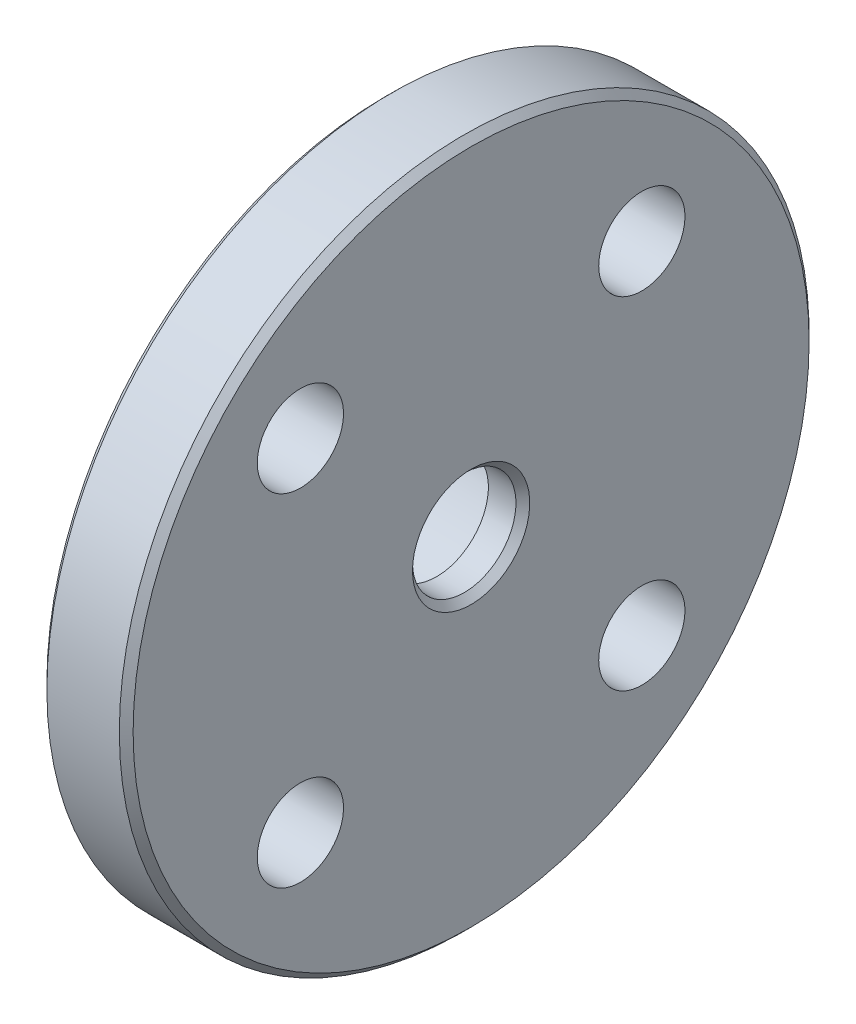
ISO-10303-21;
HEADER;
FILE_DESCRIPTION(('STEP AP214'),'2;1');
FILE_NAME('part.step','',(''),(''),'','','');
FILE_SCHEMA(('AUTOMOTIVE_DESIGN { 1 0 10303 214 1 1 1 1 }'));
ENDSEC;
DATA;
#1=APPLICATION_CONTEXT('core data for automotive mechanical design processes');
#2=APPLICATION_PROTOCOL_DEFINITION('international standard','automotive_design',2000,#1);
#3=PRODUCT_CONTEXT('',#1,'mechanical');
#4=PRODUCT('Part','Part','',(#3));
#5=PRODUCT_RELATED_PRODUCT_CATEGORY('part','',(#4));
#6=PRODUCT_DEFINITION_FORMATION('','',#4);
#7=PRODUCT_DEFINITION_CONTEXT('part definition',#1,'design');
#8=PRODUCT_DEFINITION('design','',#6,#7);
#9=PRODUCT_DEFINITION_SHAPE('','',#8);
#10=(LENGTH_UNIT() NAMED_UNIT(*) SI_UNIT(.MILLI.,.METRE.));
#11=(NAMED_UNIT(*) PLANE_ANGLE_UNIT() SI_UNIT($,.RADIAN.));
#12=(NAMED_UNIT(*) SI_UNIT($,.STERADIAN.) SOLID_ANGLE_UNIT());
#13=UNCERTAINTY_MEASURE_WITH_UNIT(LENGTH_MEASURE(1.E-05),#10,'distance_accuracy_value','');
#14=(GEOMETRIC_REPRESENTATION_CONTEXT(3) GLOBAL_UNCERTAINTY_ASSIGNED_CONTEXT((#13)) GLOBAL_UNIT_ASSIGNED_CONTEXT((#10,
#11,#12)) REPRESENTATION_CONTEXT('',''));
#15=CARTESIAN_POINT('',(0.,0.,0.));
#16=DIRECTION('',(0.,0.,1.));
#17=DIRECTION('',(1.,0.,0.));
#18=AXIS2_PLACEMENT_3D('',#15,#16,#17);
#19=CARTESIAN_POINT('',(0.,0.,0.));
#20=DIRECTION('',(-1.,0.,0.));
#21=DIRECTION('',(0.,0.,1.));
#22=AXIS2_PLACEMENT_3D('',#19,#20,#21);
#23=CYLINDRICAL_SURFACE('',#22,3.);
#24=CARTESIAN_POINT('',(3.5,0.,0.));
#25=DIRECTION('',(-1.,0.,0.));
#26=DIRECTION('',(0.,0.,1.));
#27=AXIS2_PLACEMENT_3D('',#24,#25,#26);
#28=CIRCLE('',#27,3.);
#29=CARTESIAN_POINT('',(3.5,0.,3.));
#30=VERTEX_POINT('',#29);
#31=EDGE_CURVE('E73',#30,#30,#28,.T.);
#32=ORIENTED_EDGE('',*,*,#31,.F.);
#33=EDGE_LOOP('',(#32));
#34=FACE_BOUND('',#33,.T.);
#35=CARTESIAN_POINT('',(0.,0.,0.));
#36=DIRECTION('',(-1.,0.,0.));
#37=DIRECTION('',(0.,0.,1.));
#38=AXIS2_PLACEMENT_3D('',#35,#36,#37);
#39=CIRCLE('',#38,3.);
#40=CARTESIAN_POINT('',(0.,0.,3.));
#41=VERTEX_POINT('',#40);
#42=EDGE_CURVE('E64',#41,#41,#39,.T.);
#43=ORIENTED_EDGE('',*,*,#42,.T.);
#44=EDGE_LOOP('',(#43));
#45=FACE_BOUND('',#44,.T.);
#46=ADVANCED_FACE('F32',(#34,#45),#23,.F.);
#47=CARTESIAN_POINT('',(0.,3.,0.));
#48=DIRECTION('',(1.,0.,0.));
#49=DIRECTION('',(0.,0.,-1.));
#50=AXIS2_PLACEMENT_3D('',#47,#48,#49);
#51=PLANE('',#50);
#52=CARTESIAN_POINT('',(0.,0.,0.));
#53=DIRECTION('',(1.,0.,0.));
#54=DIRECTION('',(0.,0.,-1.));
#55=AXIS2_PLACEMENT_3D('',#52,#53,#54);
#56=CIRCLE('',#55,4.3);
#57=CARTESIAN_POINT('',(0.,0.,-4.3));
#58=VERTEX_POINT('',#57);
#59=EDGE_CURVE('E39',#58,#58,#56,.F.);
#60=ORIENTED_EDGE('',*,*,#59,.T.);
#61=EDGE_LOOP('',(#60));
#62=FACE_BOUND('',#61,.T.);
#63=ORIENTED_EDGE('',*,*,#42,.F.);
#64=EDGE_LOOP('',(#63));
#65=FACE_BOUND('',#64,.T.);
#66=ADVANCED_FACE('F124',(#62,#65),#51,.F.);
#67=CARTESIAN_POINT('',(0.,0.,0.));
#68=DIRECTION('',(-1.,0.,0.));
#69=DIRECTION('',(0.,0.,1.));
#70=AXIS2_PLACEMENT_3D('',#67,#68,#69);
#71=CYLINDRICAL_SURFACE('',#70,4.5);
#72=CARTESIAN_POINT('',(0.200000000000001,0.,0.));
#73=DIRECTION('',(1.,0.,0.));
#74=DIRECTION('',(0.,0.,-1.));
#75=AXIS2_PLACEMENT_3D('',#72,#73,#74);
#76=CIRCLE('',#75,4.5);
#77=CARTESIAN_POINT('',(0.200000000000001,0.,-4.5));
#78=VERTEX_POINT('',#77);
#79=EDGE_CURVE('E10',#78,#78,#76,.T.);
#80=ORIENTED_EDGE('',*,*,#79,.T.);
#81=EDGE_LOOP('',(#80));
#82=FACE_BOUND('',#81,.T.);
#83=CARTESIAN_POINT('',(2.,0.,0.));
#84=DIRECTION('',(-1.,0.,0.));
#85=DIRECTION('',(0.,0.,1.));
#86=AXIS2_PLACEMENT_3D('',#83,#84,#85);
#87=CIRCLE('',#86,4.5);
#88=CARTESIAN_POINT('',(2.,0.,4.5));
#89=VERTEX_POINT('',#88);
#90=EDGE_CURVE('E67',#89,#89,#87,.T.);
#91=ORIENTED_EDGE('',*,*,#90,.T.);
#92=EDGE_LOOP('',(#91));
#93=FACE_BOUND('',#92,.T.);
#94=ADVANCED_FACE('F116',(#82,#93),#71,.T.);
#95=CARTESIAN_POINT('',(2.,4.5,0.));
#96=DIRECTION('',(1.,0.,0.));
#97=DIRECTION('',(0.,0.,-1.));
#98=AXIS2_PLACEMENT_3D('',#95,#96,#97);
#99=PLANE('',#98);
#100=CARTESIAN_POINT('',(2.,0.,0.));
#101=DIRECTION('',(1.,0.,0.));
#102=DIRECTION('',(0.,0.,-1.));
#103=AXIS2_PLACEMENT_3D('',#100,#101,#102);
#104=CIRCLE('',#103,9.79999999999999);
#105=CARTESIAN_POINT('',(2.,0.,-9.79999999999999));
#106=VERTEX_POINT('',#105);
#107=EDGE_CURVE('E43',#106,#106,#104,.F.);
#108=ORIENTED_EDGE('',*,*,#107,.T.);
#109=EDGE_LOOP('',(#108));
#110=FACE_BOUND('',#109,.T.);
#111=CARTESIAN_POINT('',(2.,4.94974746830582,-4.94974746830584));
#112=DIRECTION('',(-1.,0.,0.));
#113=DIRECTION('',(0.,0.,1.));
#114=AXIS2_PLACEMENT_3D('',#111,#112,#113);
#115=CIRCLE('',#114,1.25);
#116=CARTESIAN_POINT('',(2.,4.94974746830582,-3.69974746830584));
#117=VERTEX_POINT('',#116);
#118=EDGE_CURVE('E83',#117,#117,#115,.T.);
#119=ORIENTED_EDGE('',*,*,#118,.F.);
#120=EDGE_LOOP('',(#119));
#121=FACE_BOUND('',#120,.T.);
#122=CARTESIAN_POINT('',(2.,-4.94974746830584,-4.94974746830582));
#123=DIRECTION('',(-1.,0.,0.));
#124=DIRECTION('',(0.,0.,1.));
#125=AXIS2_PLACEMENT_3D('',#122,#123,#124);
#126=CIRCLE('',#125,1.25);
#127=CARTESIAN_POINT('',(2.,-4.94974746830584,-3.69974746830582));
#128=VERTEX_POINT('',#127);
#129=EDGE_CURVE('E89',#128,#128,#126,.T.);
#130=ORIENTED_EDGE('',*,*,#129,.F.);
#131=EDGE_LOOP('',(#130));
#132=FACE_BOUND('',#131,.T.);
#133=CARTESIAN_POINT('',(2.,-4.94974746830582,4.94974746830584));
#134=DIRECTION('',(-1.,0.,0.));
#135=DIRECTION('',(0.,0.,1.));
#136=AXIS2_PLACEMENT_3D('',#133,#134,#135);
#137=CIRCLE('',#136,1.25);
#138=CARTESIAN_POINT('',(2.,-4.94974746830582,6.19974746830584));
#139=VERTEX_POINT('',#138);
#140=EDGE_CURVE('E95',#139,#139,#137,.T.);
#141=ORIENTED_EDGE('',*,*,#140,.F.);
#142=EDGE_LOOP('',(#141));
#143=FACE_BOUND('',#142,.T.);
#144=CARTESIAN_POINT('',(2.,4.94974746830584,4.94974746830582));
#145=DIRECTION('',(-1.,0.,0.));
#146=DIRECTION('',(0.,0.,1.));
#147=AXIS2_PLACEMENT_3D('',#144,#145,#146);
#148=CIRCLE('',#147,1.25);
#149=CARTESIAN_POINT('',(2.,4.94974746830584,6.19974746830582));
#150=VERTEX_POINT('',#149);
#151=EDGE_CURVE('E77',#150,#150,#148,.T.);
#152=ORIENTED_EDGE('',*,*,#151,.F.);
#153=EDGE_LOOP('',(#152));
#154=FACE_BOUND('',#153,.T.);
#155=ORIENTED_EDGE('',*,*,#90,.F.);
#156=EDGE_LOOP('',(#155));
#157=FACE_BOUND('',#156,.T.);
#158=ADVANCED_FACE('F112',(#110,#121,#132,#143,#154,#157),#99,.F.);
#159=CARTESIAN_POINT('',(0.,0.,0.));
#160=DIRECTION('',(-1.,0.,0.));
#161=DIRECTION('',(0.,0.,1.));
#162=AXIS2_PLACEMENT_3D('',#159,#160,#161);
#163=CYLINDRICAL_SURFACE('',#162,10.);
#164=CARTESIAN_POINT('',(4.3,0.,0.));
#165=DIRECTION('',(-1.,0.,0.));
#166=DIRECTION('',(0.,0.,1.));
#167=AXIS2_PLACEMENT_3D('',#164,#165,#166);
#168=CIRCLE('',#167,10.);
#169=CARTESIAN_POINT('',(4.3,0.,10.));
#170=VERTEX_POINT('',#169);
#171=EDGE_CURVE('E47',#170,#170,#168,.T.);
#172=ORIENTED_EDGE('',*,*,#171,.T.);
#173=EDGE_LOOP('',(#172));
#174=FACE_BOUND('',#173,.T.);
#175=CARTESIAN_POINT('',(2.20000000000001,0.,0.));
#176=DIRECTION('',(1.,0.,0.));
#177=DIRECTION('',(0.,0.,-1.));
#178=AXIS2_PLACEMENT_3D('',#175,#176,#177);
#179=CIRCLE('',#178,10.);
#180=CARTESIAN_POINT('',(2.20000000000001,0.,-10.));
#181=VERTEX_POINT('',#180);
#182=EDGE_CURVE('E52',#181,#181,#179,.T.);
#183=ORIENTED_EDGE('',*,*,#182,.T.);
#184=EDGE_LOOP('',(#183));
#185=FACE_BOUND('',#184,.T.);
#186=ADVANCED_FACE('F115',(#174,#185),#163,.T.);
#187=CARTESIAN_POINT('',(4.5,10.,0.));
#188=DIRECTION('',(-1.,0.,0.));
#189=DIRECTION('',(0.,0.,1.));
#190=AXIS2_PLACEMENT_3D('',#187,#188,#189);
#191=PLANE('',#190);
#192=CARTESIAN_POINT('',(4.5,0.,0.));
#193=DIRECTION('',(-1.,0.,0.));
#194=DIRECTION('',(0.,0.,1.));
#195=AXIS2_PLACEMENT_3D('',#192,#193,#194);
#196=CIRCLE('',#195,1.7);
#197=CARTESIAN_POINT('',(4.5,0.,1.7));
#198=VERTEX_POINT('',#197);
#199=EDGE_CURVE('E58',#198,#198,#196,.T.);
#200=ORIENTED_EDGE('',*,*,#199,.T.);
#201=EDGE_LOOP('',(#200));
#202=FACE_BOUND('',#201,.T.);
#203=CARTESIAN_POINT('',(4.5,0.,0.));
#204=DIRECTION('',(-1.,0.,0.));
#205=DIRECTION('',(0.,0.,1.));
#206=AXIS2_PLACEMENT_3D('',#203,#204,#205);
#207=CIRCLE('',#206,9.79999999999999);
#208=CARTESIAN_POINT('',(4.5,0.,9.79999999999999));
#209=VERTEX_POINT('',#208);
#210=EDGE_CURVE('E61',#209,#209,#207,.F.);
#211=ORIENTED_EDGE('',*,*,#210,.T.);
#212=EDGE_LOOP('',(#211));
#213=FACE_BOUND('',#212,.T.);
#214=CARTESIAN_POINT('',(4.5,4.94974746830582,-4.94974746830584));
#215=DIRECTION('',(-1.,0.,0.));
#216=DIRECTION('',(0.,0.,1.));
#217=AXIS2_PLACEMENT_3D('',#214,#215,#216);
#218=CIRCLE('',#217,1.25);
#219=CARTESIAN_POINT('',(4.5,4.94974746830582,-3.69974746830584));
#220=VERTEX_POINT('',#219);
#221=EDGE_CURVE('E86',#220,#220,#218,.T.);
#222=ORIENTED_EDGE('',*,*,#221,.T.);
#223=EDGE_LOOP('',(#222));
#224=FACE_BOUND('',#223,.T.);
#225=CARTESIAN_POINT('',(4.5,-4.94974746830584,-4.94974746830582));
#226=DIRECTION('',(-1.,0.,0.));
#227=DIRECTION('',(0.,0.,1.));
#228=AXIS2_PLACEMENT_3D('',#225,#226,#227);
#229=CIRCLE('',#228,1.25);
#230=CARTESIAN_POINT('',(4.5,-4.94974746830584,-3.69974746830582));
#231=VERTEX_POINT('',#230);
#232=EDGE_CURVE('E92',#231,#231,#229,.T.);
#233=ORIENTED_EDGE('',*,*,#232,.T.);
#234=EDGE_LOOP('',(#233));
#235=FACE_BOUND('',#234,.T.);
#236=CARTESIAN_POINT('',(4.5,-4.94974746830582,4.94974746830584));
#237=DIRECTION('',(-1.,0.,0.));
#238=DIRECTION('',(0.,0.,1.));
#239=AXIS2_PLACEMENT_3D('',#236,#237,#238);
#240=CIRCLE('',#239,1.25);
#241=CARTESIAN_POINT('',(4.5,-4.94974746830582,6.19974746830584));
#242=VERTEX_POINT('',#241);
#243=EDGE_CURVE('E80',#242,#242,#240,.T.);
#244=ORIENTED_EDGE('',*,*,#243,.T.);
#245=EDGE_LOOP('',(#244));
#246=FACE_BOUND('',#245,.T.);
#247=CARTESIAN_POINT('',(4.5,4.94974746830584,4.94974746830582));
#248=DIRECTION('',(-1.,0.,0.));
#249=DIRECTION('',(0.,0.,1.));
#250=AXIS2_PLACEMENT_3D('',#247,#248,#249);
#251=CIRCLE('',#250,1.25);
#252=CARTESIAN_POINT('',(4.5,4.94974746830584,6.19974746830582));
#253=VERTEX_POINT('',#252);
#254=EDGE_CURVE('E76',#253,#253,#251,.T.);
#255=ORIENTED_EDGE('',*,*,#254,.T.);
#256=EDGE_LOOP('',(#255));
#257=FACE_BOUND('',#256,.T.);
#258=ADVANCED_FACE('F101',(#202,#213,#224,#235,#246,#257),#191,.F.);
#259=CARTESIAN_POINT('',(0.,0.,0.));
#260=DIRECTION('',(-1.,0.,0.));
#261=DIRECTION('',(0.,0.,1.));
#262=AXIS2_PLACEMENT_3D('',#259,#260,#261);
#263=CYLINDRICAL_SURFACE('',#262,1.5);
#264=CARTESIAN_POINT('',(4.30000000000001,0.,0.));
#265=DIRECTION('',(-1.,0.,0.));
#266=DIRECTION('',(0.,0.,1.));
#267=AXIS2_PLACEMENT_3D('',#264,#265,#266);
#268=CIRCLE('',#267,1.5);
#269=CARTESIAN_POINT('',(4.30000000000001,0.,1.5));
#270=VERTEX_POINT('',#269);
#271=EDGE_CURVE('E55',#270,#270,#268,.F.);
#272=ORIENTED_EDGE('',*,*,#271,.T.);
#273=EDGE_LOOP('',(#272));
#274=FACE_BOUND('',#273,.T.);
#275=CARTESIAN_POINT('',(3.5,0.,0.));
#276=DIRECTION('',(-1.,0.,0.));
#277=DIRECTION('',(0.,0.,1.));
#278=AXIS2_PLACEMENT_3D('',#275,#276,#277);
#279=CIRCLE('',#278,1.5);
#280=CARTESIAN_POINT('',(3.5,0.,1.5));
#281=VERTEX_POINT('',#280);
#282=EDGE_CURVE('E70',#281,#281,#279,.T.);
#283=ORIENTED_EDGE('',*,*,#282,.T.);
#284=EDGE_LOOP('',(#283));
#285=FACE_BOUND('',#284,.T.);
#286=ADVANCED_FACE('F177',(#274,#285),#263,.F.);
#287=CARTESIAN_POINT('',(3.5,1.5,0.));
#288=DIRECTION('',(1.,0.,0.));
#289=DIRECTION('',(0.,0.,-1.));
#290=AXIS2_PLACEMENT_3D('',#287,#288,#289);
#291=PLANE('',#290);
#292=ORIENTED_EDGE('',*,*,#282,.F.);
#293=EDGE_LOOP('',(#292));
#294=FACE_BOUND('',#293,.T.);
#295=ORIENTED_EDGE('',*,*,#31,.T.);
#296=EDGE_LOOP('',(#295));
#297=FACE_BOUND('',#296,.T.);
#298=ADVANCED_FACE('F173',(#294,#297),#291,.F.);
#299=CARTESIAN_POINT('',(4.5,4.94974746830584,4.94974746830582));
#300=DIRECTION('',(-1.,0.,0.));
#301=DIRECTION('',(0.,0.,1.));
#302=AXIS2_PLACEMENT_3D('',#299,#300,#301);
#303=CYLINDRICAL_SURFACE('',#302,1.25);
#304=CARTESIAN_POINT('',(4.5,4.94974746830584,6.19974746830582));
#305=CARTESIAN_POINT('',(4.47395833333333,4.94974746830584,6.19974746830582));
#306=CARTESIAN_POINT('',(4.44791666666667,4.94974746830584,6.19974746830582));
#307=CARTESIAN_POINT('',(4.39583333333333,4.94974746830584,6.19974746830582));
#308=CARTESIAN_POINT('',(4.36979166666667,4.94974746830584,6.19974746830582));
#309=CARTESIAN_POINT('',(4.31770833333333,4.94974746830584,6.19974746830582));
#310=CARTESIAN_POINT('',(4.29166666666667,4.94974746830584,6.19974746830582));
#311=CARTESIAN_POINT('',(4.23958333333333,4.94974746830584,6.19974746830582));
#312=CARTESIAN_POINT('',(4.21354166666667,4.94974746830584,6.19974746830582));
#313=CARTESIAN_POINT('',(4.16145833333333,4.94974746830584,6.19974746830582));
#314=CARTESIAN_POINT('',(4.13541666666667,4.94974746830584,6.19974746830582));
#315=CARTESIAN_POINT('',(4.08333333333333,4.94974746830584,6.19974746830582));
#316=CARTESIAN_POINT('',(4.05729166666667,4.94974746830584,6.19974746830582));
#317=CARTESIAN_POINT('',(4.00520833333333,4.94974746830584,6.19974746830582));
#318=CARTESIAN_POINT('',(3.97916666666667,4.94974746830584,6.19974746830582));
#319=CARTESIAN_POINT('',(3.92708333333333,4.94974746830584,6.19974746830582));
#320=CARTESIAN_POINT('',(3.90104166666667,4.94974746830584,6.19974746830582));
#321=CARTESIAN_POINT('',(3.84895833333333,4.94974746830584,6.19974746830582));
#322=CARTESIAN_POINT('',(3.82291666666667,4.94974746830584,6.19974746830582));
#323=CARTESIAN_POINT('',(3.77083333333333,4.94974746830584,6.19974746830582));
#324=CARTESIAN_POINT('',(3.74479166666667,4.94974746830584,6.19974746830582));
#325=CARTESIAN_POINT('',(3.69270833333333,4.94974746830584,6.19974746830582));
#326=CARTESIAN_POINT('',(3.66666666666667,4.94974746830584,6.19974746830582));
#327=CARTESIAN_POINT('',(3.61458333333333,4.94974746830584,6.19974746830582));
#328=CARTESIAN_POINT('',(3.58854166666667,4.94974746830584,6.19974746830582));
#329=CARTESIAN_POINT('',(3.53645833333333,4.94974746830584,6.19974746830582));
#330=CARTESIAN_POINT('',(3.51041666666667,4.94974746830584,6.19974746830582));
#331=CARTESIAN_POINT('',(3.45833333333333,4.94974746830584,6.19974746830582));
#332=CARTESIAN_POINT('',(3.43229166666667,4.94974746830584,6.19974746830582));
#333=CARTESIAN_POINT('',(3.38020833333333,4.94974746830584,6.19974746830582));
#334=CARTESIAN_POINT('',(3.35416666666667,4.94974746830584,6.19974746830582));
#335=CARTESIAN_POINT('',(3.30208333333333,4.94974746830584,6.19974746830582));
#336=CARTESIAN_POINT('',(3.27604166666667,4.94974746830584,6.19974746830582));
#337=CARTESIAN_POINT('',(3.22395833333333,4.94974746830584,6.19974746830582));
#338=CARTESIAN_POINT('',(3.19791666666667,4.94974746830584,6.19974746830582));
#339=CARTESIAN_POINT('',(3.14583333333333,4.94974746830584,6.19974746830582));
#340=CARTESIAN_POINT('',(3.11979166666667,4.94974746830584,6.19974746830582));
#341=CARTESIAN_POINT('',(3.06770833333333,4.94974746830584,6.19974746830582));
#342=CARTESIAN_POINT('',(3.04166666666667,4.94974746830584,6.19974746830582));
#343=CARTESIAN_POINT('',(2.98958333333333,4.94974746830584,6.19974746830582));
#344=CARTESIAN_POINT('',(2.96354166666667,4.94974746830584,6.19974746830582));
#345=CARTESIAN_POINT('',(2.91145833333333,4.94974746830584,6.19974746830582));
#346=CARTESIAN_POINT('',(2.88541666666667,4.94974746830584,6.19974746830582));
#347=CARTESIAN_POINT('',(2.83333333333333,4.94974746830584,6.19974746830582));
#348=CARTESIAN_POINT('',(2.80729166666667,4.94974746830584,6.19974746830582));
#349=CARTESIAN_POINT('',(2.75520833333333,4.94974746830584,6.19974746830582));
#350=CARTESIAN_POINT('',(2.72916666666667,4.94974746830584,6.19974746830582));
#351=CARTESIAN_POINT('',(2.67708333333333,4.94974746830584,6.19974746830582));
#352=CARTESIAN_POINT('',(2.65104166666667,4.94974746830584,6.19974746830582));
#353=CARTESIAN_POINT('',(2.59895833333333,4.94974746830584,6.19974746830582));
#354=CARTESIAN_POINT('',(2.57291666666667,4.94974746830584,6.19974746830582));
#355=CARTESIAN_POINT('',(2.52083333333333,4.94974746830584,6.19974746830582));
#356=CARTESIAN_POINT('',(2.49479166666667,4.94974746830584,6.19974746830582));
#357=CARTESIAN_POINT('',(2.44270833333333,4.94974746830584,6.19974746830582));
#358=CARTESIAN_POINT('',(2.41666666666667,4.94974746830584,6.19974746830582));
#359=CARTESIAN_POINT('',(2.36458333333333,4.94974746830584,6.19974746830582));
#360=CARTESIAN_POINT('',(2.33854166666667,4.94974746830584,6.19974746830582));
#361=CARTESIAN_POINT('',(2.28645833333333,4.94974746830584,6.19974746830582));
#362=CARTESIAN_POINT('',(2.26041666666667,4.94974746830584,6.19974746830582));
#363=CARTESIAN_POINT('',(2.20833333333333,4.94974746830584,6.19974746830582));
#364=CARTESIAN_POINT('',(2.18229166666667,4.94974746830584,6.19974746830582));
#365=CARTESIAN_POINT('',(2.13020833333333,4.94974746830584,6.19974746830582));
#366=CARTESIAN_POINT('',(2.10416666666667,4.94974746830584,6.19974746830582));
#367=CARTESIAN_POINT('',(2.05208333333333,4.94974746830584,6.19974746830582));
#368=CARTESIAN_POINT('',(2.02604166666667,4.94974746830584,6.19974746830582));
#369=CARTESIAN_POINT('',(2.,4.94974746830584,6.19974746830582));
#370=B_SPLINE_CURVE_WITH_KNOTS('',3,(#304,#305,#306,#307,#308,#309,#310,#311,#312,#313,#314,
#315,#316,#317,#318,#319,#320,#321,#322,#323,#324,#325,#326,#327,#328,#329,#330,#331,#332,#333,
#334,#335,#336,#337,#338,#339,#340,#341,#342,#343,#344,#345,#346,#347,#348,#349,#350,#351,#352,
#353,#354,#355,#356,#357,#358,#359,#360,#361,#362,#363,#364,#365,#366,#367,#368,#369),
.UNSPECIFIED.,.F.,.F.,(4,2,2,2,2,2,2,2,2,2,2,2,2,2,2,2,2,2,2,2,2,2,2,2,2,2,2,2,2,2,2,2,4),(0.,
0.0781249999999992,0.156249999999999,0.234374999999999,0.312499999999999,0.390625,0.46875,
0.546875,0.625,0.703125,0.78125,0.859375,0.9375,1.015625,1.09375,1.171875,1.25,1.328125,1.40625,
1.484375,1.5625,1.640625,1.71875,1.796875,1.875,1.953125,2.03125,2.109375,2.1875,2.265625,
2.34375,2.421875,2.5),.UNSPECIFIED.);
#371=EDGE_CURVE('BSEAM108',#253,#150,#370,.T.);
#372=ORIENTED_EDGE('',*,*,#254,.F.);
#373=ORIENTED_EDGE('',*,*,#151,.T.);
#374=ORIENTED_EDGE('',*,*,#371,.T.);
#375=ORIENTED_EDGE('',*,*,#371,.F.);
#376=EDGE_LOOP('',(#372,#374,#373,#375));
#377=FACE_BOUND('',#376,.T.);
#378=ADVANCED_FACE('F108',(#377),#303,.F.);
#379=CARTESIAN_POINT('',(4.5,-4.94974746830582,4.94974746830584));
#380=DIRECTION('',(-1.,0.,0.));
#381=DIRECTION('',(0.,0.,1.));
#382=AXIS2_PLACEMENT_3D('',#379,#380,#381);
#383=CYLINDRICAL_SURFACE('',#382,1.25);
#384=CARTESIAN_POINT('',(4.5,-4.94974746830582,6.19974746830584));
#385=CARTESIAN_POINT('',(4.47395833333333,-4.94974746830582,6.19974746830584));
#386=CARTESIAN_POINT('',(4.44791666666667,-4.94974746830582,6.19974746830584));
#387=CARTESIAN_POINT('',(4.39583333333333,-4.94974746830582,6.19974746830584));
#388=CARTESIAN_POINT('',(4.36979166666667,-4.94974746830582,6.19974746830584));
#389=CARTESIAN_POINT('',(4.31770833333333,-4.94974746830582,6.19974746830584));
#390=CARTESIAN_POINT('',(4.29166666666667,-4.94974746830582,6.19974746830584));
#391=CARTESIAN_POINT('',(4.23958333333333,-4.94974746830582,6.19974746830584));
#392=CARTESIAN_POINT('',(4.21354166666667,-4.94974746830582,6.19974746830584));
#393=CARTESIAN_POINT('',(4.16145833333333,-4.94974746830582,6.19974746830584));
#394=CARTESIAN_POINT('',(4.13541666666667,-4.94974746830582,6.19974746830584));
#395=CARTESIAN_POINT('',(4.08333333333333,-4.94974746830582,6.19974746830584));
#396=CARTESIAN_POINT('',(4.05729166666667,-4.94974746830582,6.19974746830584));
#397=CARTESIAN_POINT('',(4.00520833333333,-4.94974746830582,6.19974746830584));
#398=CARTESIAN_POINT('',(3.97916666666667,-4.94974746830582,6.19974746830584));
#399=CARTESIAN_POINT('',(3.92708333333333,-4.94974746830582,6.19974746830584));
#400=CARTESIAN_POINT('',(3.90104166666667,-4.94974746830582,6.19974746830584));
#401=CARTESIAN_POINT('',(3.84895833333333,-4.94974746830582,6.19974746830584));
#402=CARTESIAN_POINT('',(3.82291666666667,-4.94974746830582,6.19974746830584));
#403=CARTESIAN_POINT('',(3.77083333333333,-4.94974746830582,6.19974746830584));
#404=CARTESIAN_POINT('',(3.74479166666667,-4.94974746830582,6.19974746830584));
#405=CARTESIAN_POINT('',(3.69270833333333,-4.94974746830582,6.19974746830584));
#406=CARTESIAN_POINT('',(3.66666666666667,-4.94974746830582,6.19974746830584));
#407=CARTESIAN_POINT('',(3.61458333333333,-4.94974746830582,6.19974746830584));
#408=CARTESIAN_POINT('',(3.58854166666667,-4.94974746830582,6.19974746830584));
#409=CARTESIAN_POINT('',(3.53645833333333,-4.94974746830582,6.19974746830584));
#410=CARTESIAN_POINT('',(3.51041666666667,-4.94974746830582,6.19974746830584));
#411=CARTESIAN_POINT('',(3.45833333333333,-4.94974746830582,6.19974746830584));
#412=CARTESIAN_POINT('',(3.43229166666667,-4.94974746830582,6.19974746830584));
#413=CARTESIAN_POINT('',(3.38020833333333,-4.94974746830582,6.19974746830584));
#414=CARTESIAN_POINT('',(3.35416666666667,-4.94974746830582,6.19974746830584));
#415=CARTESIAN_POINT('',(3.30208333333333,-4.94974746830582,6.19974746830584));
#416=CARTESIAN_POINT('',(3.27604166666667,-4.94974746830582,6.19974746830584));
#417=CARTESIAN_POINT('',(3.22395833333333,-4.94974746830582,6.19974746830584));
#418=CARTESIAN_POINT('',(3.19791666666667,-4.94974746830582,6.19974746830584));
#419=CARTESIAN_POINT('',(3.14583333333333,-4.94974746830582,6.19974746830584));
#420=CARTESIAN_POINT('',(3.11979166666667,-4.94974746830582,6.19974746830584));
#421=CARTESIAN_POINT('',(3.06770833333333,-4.94974746830582,6.19974746830584));
#422=CARTESIAN_POINT('',(3.04166666666667,-4.94974746830582,6.19974746830584));
#423=CARTESIAN_POINT('',(2.98958333333333,-4.94974746830582,6.19974746830584));
#424=CARTESIAN_POINT('',(2.96354166666667,-4.94974746830582,6.19974746830584));
#425=CARTESIAN_POINT('',(2.91145833333333,-4.94974746830582,6.19974746830584));
#426=CARTESIAN_POINT('',(2.88541666666667,-4.94974746830582,6.19974746830584));
#427=CARTESIAN_POINT('',(2.83333333333333,-4.94974746830582,6.19974746830584));
#428=CARTESIAN_POINT('',(2.80729166666667,-4.94974746830582,6.19974746830584));
#429=CARTESIAN_POINT('',(2.75520833333333,-4.94974746830582,6.19974746830584));
#430=CARTESIAN_POINT('',(2.72916666666667,-4.94974746830582,6.19974746830584));
#431=CARTESIAN_POINT('',(2.67708333333333,-4.94974746830582,6.19974746830584));
#432=CARTESIAN_POINT('',(2.65104166666667,-4.94974746830582,6.19974746830584));
#433=CARTESIAN_POINT('',(2.59895833333333,-4.94974746830582,6.19974746830584));
#434=CARTESIAN_POINT('',(2.57291666666667,-4.94974746830582,6.19974746830584));
#435=CARTESIAN_POINT('',(2.52083333333333,-4.94974746830582,6.19974746830584));
#436=CARTESIAN_POINT('',(2.49479166666667,-4.94974746830582,6.19974746830584));
#437=CARTESIAN_POINT('',(2.44270833333333,-4.94974746830582,6.19974746830584));
#438=CARTESIAN_POINT('',(2.41666666666667,-4.94974746830582,6.19974746830584));
#439=CARTESIAN_POINT('',(2.36458333333333,-4.94974746830582,6.19974746830584));
#440=CARTESIAN_POINT('',(2.33854166666667,-4.94974746830582,6.19974746830584));
#441=CARTESIAN_POINT('',(2.28645833333333,-4.94974746830582,6.19974746830584));
#442=CARTESIAN_POINT('',(2.26041666666667,-4.94974746830582,6.19974746830584));
#443=CARTESIAN_POINT('',(2.20833333333333,-4.94974746830582,6.19974746830584));
#444=CARTESIAN_POINT('',(2.18229166666667,-4.94974746830582,6.19974746830584));
#445=CARTESIAN_POINT('',(2.13020833333333,-4.94974746830582,6.19974746830584));
#446=CARTESIAN_POINT('',(2.10416666666667,-4.94974746830582,6.19974746830584));
#447=CARTESIAN_POINT('',(2.05208333333333,-4.94974746830582,6.19974746830584));
#448=CARTESIAN_POINT('',(2.02604166666667,-4.94974746830582,6.19974746830584));
#449=CARTESIAN_POINT('',(2.,-4.94974746830582,6.19974746830584));
#450=B_SPLINE_CURVE_WITH_KNOTS('',3,(#384,#385,#386,#387,#388,#389,#390,#391,#392,#393,#394,
#395,#396,#397,#398,#399,#400,#401,#402,#403,#404,#405,#406,#407,#408,#409,#410,#411,#412,#413,
#414,#415,#416,#417,#418,#419,#420,#421,#422,#423,#424,#425,#426,#427,#428,#429,#430,#431,#432,
#433,#434,#435,#436,#437,#438,#439,#440,#441,#442,#443,#444,#445,#446,#447,#448,#449),
.UNSPECIFIED.,.F.,.F.,(4,2,2,2,2,2,2,2,2,2,2,2,2,2,2,2,2,2,2,2,2,2,2,2,2,2,2,2,2,2,2,2,4),(0.,
0.0781249999999992,0.156249999999999,0.234374999999999,0.312499999999999,0.390625,0.46875,
0.546875,0.625,0.703125,0.78125,0.859375,0.9375,1.015625,1.09375,1.171875,1.25,1.328125,1.40625,
1.484375,1.5625,1.640625,1.71875,1.796875,1.875,1.953125,2.03125,2.109375,2.1875,2.265625,
2.34375,2.421875,2.5),.UNSPECIFIED.);
#451=EDGE_CURVE('BSEAM104',#242,#139,#450,.T.);
#452=ORIENTED_EDGE('',*,*,#243,.F.);
#453=ORIENTED_EDGE('',*,*,#140,.T.);
#454=ORIENTED_EDGE('',*,*,#451,.T.);
#455=ORIENTED_EDGE('',*,*,#451,.F.);
#456=EDGE_LOOP('',(#452,#454,#453,#455));
#457=FACE_BOUND('',#456,.T.);
#458=ADVANCED_FACE('F104',(#457),#383,.F.);
#459=CARTESIAN_POINT('',(4.5,-4.94974746830584,-4.94974746830582));
#460=DIRECTION('',(-1.,0.,0.));
#461=DIRECTION('',(0.,0.,1.));
#462=AXIS2_PLACEMENT_3D('',#459,#460,#461);
#463=CYLINDRICAL_SURFACE('',#462,1.25);
#464=CARTESIAN_POINT('',(4.5,-4.94974746830584,-3.69974746830582));
#465=CARTESIAN_POINT('',(4.47395833333333,-4.94974746830584,-3.69974746830582));
#466=CARTESIAN_POINT('',(4.44791666666667,-4.94974746830584,-3.69974746830582));
#467=CARTESIAN_POINT('',(4.39583333333333,-4.94974746830584,-3.69974746830582));
#468=CARTESIAN_POINT('',(4.36979166666667,-4.94974746830584,-3.69974746830582));
#469=CARTESIAN_POINT('',(4.31770833333333,-4.94974746830584,-3.69974746830582));
#470=CARTESIAN_POINT('',(4.29166666666667,-4.94974746830584,-3.69974746830582));
#471=CARTESIAN_POINT('',(4.23958333333333,-4.94974746830584,-3.69974746830582));
#472=CARTESIAN_POINT('',(4.21354166666667,-4.94974746830584,-3.69974746830582));
#473=CARTESIAN_POINT('',(4.16145833333333,-4.94974746830584,-3.69974746830582));
#474=CARTESIAN_POINT('',(4.13541666666667,-4.94974746830584,-3.69974746830582));
#475=CARTESIAN_POINT('',(4.08333333333333,-4.94974746830584,-3.69974746830582));
#476=CARTESIAN_POINT('',(4.05729166666667,-4.94974746830584,-3.69974746830582));
#477=CARTESIAN_POINT('',(4.00520833333333,-4.94974746830584,-3.69974746830582));
#478=CARTESIAN_POINT('',(3.97916666666667,-4.94974746830584,-3.69974746830582));
#479=CARTESIAN_POINT('',(3.92708333333333,-4.94974746830584,-3.69974746830582));
#480=CARTESIAN_POINT('',(3.90104166666667,-4.94974746830584,-3.69974746830582));
#481=CARTESIAN_POINT('',(3.84895833333333,-4.94974746830584,-3.69974746830582));
#482=CARTESIAN_POINT('',(3.82291666666667,-4.94974746830584,-3.69974746830582));
#483=CARTESIAN_POINT('',(3.77083333333333,-4.94974746830584,-3.69974746830582));
#484=CARTESIAN_POINT('',(3.74479166666667,-4.94974746830584,-3.69974746830582));
#485=CARTESIAN_POINT('',(3.69270833333333,-4.94974746830584,-3.69974746830582));
#486=CARTESIAN_POINT('',(3.66666666666667,-4.94974746830584,-3.69974746830582));
#487=CARTESIAN_POINT('',(3.61458333333333,-4.94974746830584,-3.69974746830582));
#488=CARTESIAN_POINT('',(3.58854166666667,-4.94974746830584,-3.69974746830582));
#489=CARTESIAN_POINT('',(3.53645833333333,-4.94974746830584,-3.69974746830582));
#490=CARTESIAN_POINT('',(3.51041666666667,-4.94974746830584,-3.69974746830582));
#491=CARTESIAN_POINT('',(3.45833333333333,-4.94974746830584,-3.69974746830582));
#492=CARTESIAN_POINT('',(3.43229166666667,-4.94974746830584,-3.69974746830582));
#493=CARTESIAN_POINT('',(3.38020833333333,-4.94974746830584,-3.69974746830582));
#494=CARTESIAN_POINT('',(3.35416666666667,-4.94974746830584,-3.69974746830582));
#495=CARTESIAN_POINT('',(3.30208333333333,-4.94974746830584,-3.69974746830582));
#496=CARTESIAN_POINT('',(3.27604166666667,-4.94974746830584,-3.69974746830582));
#497=CARTESIAN_POINT('',(3.22395833333333,-4.94974746830584,-3.69974746830582));
#498=CARTESIAN_POINT('',(3.19791666666667,-4.94974746830584,-3.69974746830582));
#499=CARTESIAN_POINT('',(3.14583333333333,-4.94974746830584,-3.69974746830582));
#500=CARTESIAN_POINT('',(3.11979166666667,-4.94974746830584,-3.69974746830582));
#501=CARTESIAN_POINT('',(3.06770833333333,-4.94974746830584,-3.69974746830582));
#502=CARTESIAN_POINT('',(3.04166666666667,-4.94974746830584,-3.69974746830582));
#503=CARTESIAN_POINT('',(2.98958333333333,-4.94974746830584,-3.69974746830582));
#504=CARTESIAN_POINT('',(2.96354166666667,-4.94974746830584,-3.69974746830582));
#505=CARTESIAN_POINT('',(2.91145833333333,-4.94974746830584,-3.69974746830582));
#506=CARTESIAN_POINT('',(2.88541666666667,-4.94974746830584,-3.69974746830582));
#507=CARTESIAN_POINT('',(2.83333333333333,-4.94974746830584,-3.69974746830582));
#508=CARTESIAN_POINT('',(2.80729166666667,-4.94974746830584,-3.69974746830582));
#509=CARTESIAN_POINT('',(2.75520833333333,-4.94974746830584,-3.69974746830582));
#510=CARTESIAN_POINT('',(2.72916666666667,-4.94974746830584,-3.69974746830582));
#511=CARTESIAN_POINT('',(2.67708333333333,-4.94974746830584,-3.69974746830582));
#512=CARTESIAN_POINT('',(2.65104166666667,-4.94974746830584,-3.69974746830582));
#513=CARTESIAN_POINT('',(2.59895833333333,-4.94974746830584,-3.69974746830582));
#514=CARTESIAN_POINT('',(2.57291666666667,-4.94974746830584,-3.69974746830582));
#515=CARTESIAN_POINT('',(2.52083333333333,-4.94974746830584,-3.69974746830582));
#516=CARTESIAN_POINT('',(2.49479166666667,-4.94974746830584,-3.69974746830582));
#517=CARTESIAN_POINT('',(2.44270833333333,-4.94974746830584,-3.69974746830582));
#518=CARTESIAN_POINT('',(2.41666666666667,-4.94974746830584,-3.69974746830582));
#519=CARTESIAN_POINT('',(2.36458333333333,-4.94974746830584,-3.69974746830582));
#520=CARTESIAN_POINT('',(2.33854166666667,-4.94974746830584,-3.69974746830582));
#521=CARTESIAN_POINT('',(2.28645833333333,-4.94974746830584,-3.69974746830582));
#522=CARTESIAN_POINT('',(2.26041666666667,-4.94974746830584,-3.69974746830582));
#523=CARTESIAN_POINT('',(2.20833333333333,-4.94974746830584,-3.69974746830582));
#524=CARTESIAN_POINT('',(2.18229166666667,-4.94974746830584,-3.69974746830582));
#525=CARTESIAN_POINT('',(2.13020833333333,-4.94974746830584,-3.69974746830582));
#526=CARTESIAN_POINT('',(2.10416666666667,-4.94974746830584,-3.69974746830582));
#527=CARTESIAN_POINT('',(2.05208333333333,-4.94974746830584,-3.69974746830582));
#528=CARTESIAN_POINT('',(2.02604166666667,-4.94974746830584,-3.69974746830582));
#529=CARTESIAN_POINT('',(2.,-4.94974746830584,-3.69974746830582));
#530=B_SPLINE_CURVE_WITH_KNOTS('',3,(#464,#465,#466,#467,#468,#469,#470,#471,#472,#473,#474,
#475,#476,#477,#478,#479,#480,#481,#482,#483,#484,#485,#486,#487,#488,#489,#490,#491,#492,#493,
#494,#495,#496,#497,#498,#499,#500,#501,#502,#503,#504,#505,#506,#507,#508,#509,#510,#511,#512,
#513,#514,#515,#516,#517,#518,#519,#520,#521,#522,#523,#524,#525,#526,#527,#528,#529),
.UNSPECIFIED.,.F.,.F.,(4,2,2,2,2,2,2,2,2,2,2,2,2,2,2,2,2,2,2,2,2,2,2,2,2,2,2,2,2,2,2,2,4),(0.,
0.0781249999999992,0.156249999999999,0.234374999999999,0.312499999999999,0.390625,0.46875,
0.546875,0.625,0.703125,0.78125,0.859375,0.9375,1.015625,1.09375,1.171875,1.25,1.328125,1.40625,
1.484375,1.5625,1.640625,1.71875,1.796875,1.875,1.953125,2.03125,2.109375,2.1875,2.265625,
2.34375,2.421875,2.5),.UNSPECIFIED.);
#531=EDGE_CURVE('BSEAM107',#231,#128,#530,.T.);
#532=ORIENTED_EDGE('',*,*,#232,.F.);
#533=ORIENTED_EDGE('',*,*,#129,.T.);
#534=ORIENTED_EDGE('',*,*,#531,.T.);
#535=ORIENTED_EDGE('',*,*,#531,.F.);
#536=EDGE_LOOP('',(#532,#534,#533,#535));
#537=FACE_BOUND('',#536,.T.);
#538=ADVANCED_FACE('F107',(#537),#463,.F.);
#539=CARTESIAN_POINT('',(4.5,4.94974746830582,-4.94974746830584));
#540=DIRECTION('',(-1.,0.,0.));
#541=DIRECTION('',(0.,0.,1.));
#542=AXIS2_PLACEMENT_3D('',#539,#540,#541);
#543=CYLINDRICAL_SURFACE('',#542,1.25);
#544=CARTESIAN_POINT('',(4.5,4.94974746830582,-3.69974746830584));
#545=CARTESIAN_POINT('',(4.47395833333333,4.94974746830582,-3.69974746830584));
#546=CARTESIAN_POINT('',(4.44791666666667,4.94974746830582,-3.69974746830584));
#547=CARTESIAN_POINT('',(4.39583333333333,4.94974746830582,-3.69974746830584));
#548=CARTESIAN_POINT('',(4.36979166666667,4.94974746830582,-3.69974746830584));
#549=CARTESIAN_POINT('',(4.31770833333333,4.94974746830582,-3.69974746830584));
#550=CARTESIAN_POINT('',(4.29166666666667,4.94974746830582,-3.69974746830584));
#551=CARTESIAN_POINT('',(4.23958333333333,4.94974746830582,-3.69974746830584));
#552=CARTESIAN_POINT('',(4.21354166666667,4.94974746830582,-3.69974746830584));
#553=CARTESIAN_POINT('',(4.16145833333333,4.94974746830582,-3.69974746830584));
#554=CARTESIAN_POINT('',(4.13541666666667,4.94974746830582,-3.69974746830584));
#555=CARTESIAN_POINT('',(4.08333333333333,4.94974746830582,-3.69974746830584));
#556=CARTESIAN_POINT('',(4.05729166666667,4.94974746830582,-3.69974746830584));
#557=CARTESIAN_POINT('',(4.00520833333333,4.94974746830582,-3.69974746830584));
#558=CARTESIAN_POINT('',(3.97916666666667,4.94974746830582,-3.69974746830584));
#559=CARTESIAN_POINT('',(3.92708333333333,4.94974746830582,-3.69974746830584));
#560=CARTESIAN_POINT('',(3.90104166666667,4.94974746830582,-3.69974746830584));
#561=CARTESIAN_POINT('',(3.84895833333333,4.94974746830582,-3.69974746830584));
#562=CARTESIAN_POINT('',(3.82291666666667,4.94974746830582,-3.69974746830584));
#563=CARTESIAN_POINT('',(3.77083333333333,4.94974746830582,-3.69974746830584));
#564=CARTESIAN_POINT('',(3.74479166666667,4.94974746830582,-3.69974746830584));
#565=CARTESIAN_POINT('',(3.69270833333333,4.94974746830582,-3.69974746830584));
#566=CARTESIAN_POINT('',(3.66666666666667,4.94974746830582,-3.69974746830584));
#567=CARTESIAN_POINT('',(3.61458333333333,4.94974746830582,-3.69974746830584));
#568=CARTESIAN_POINT('',(3.58854166666667,4.94974746830582,-3.69974746830584));
#569=CARTESIAN_POINT('',(3.53645833333333,4.94974746830582,-3.69974746830584));
#570=CARTESIAN_POINT('',(3.51041666666667,4.94974746830582,-3.69974746830584));
#571=CARTESIAN_POINT('',(3.45833333333333,4.94974746830582,-3.69974746830584));
#572=CARTESIAN_POINT('',(3.43229166666667,4.94974746830582,-3.69974746830584));
#573=CARTESIAN_POINT('',(3.38020833333333,4.94974746830582,-3.69974746830584));
#574=CARTESIAN_POINT('',(3.35416666666667,4.94974746830582,-3.69974746830584));
#575=CARTESIAN_POINT('',(3.30208333333333,4.94974746830582,-3.69974746830584));
#576=CARTESIAN_POINT('',(3.27604166666667,4.94974746830582,-3.69974746830584));
#577=CARTESIAN_POINT('',(3.22395833333333,4.94974746830582,-3.69974746830584));
#578=CARTESIAN_POINT('',(3.19791666666667,4.94974746830582,-3.69974746830584));
#579=CARTESIAN_POINT('',(3.14583333333333,4.94974746830582,-3.69974746830584));
#580=CARTESIAN_POINT('',(3.11979166666667,4.94974746830582,-3.69974746830584));
#581=CARTESIAN_POINT('',(3.06770833333333,4.94974746830582,-3.69974746830584));
#582=CARTESIAN_POINT('',(3.04166666666667,4.94974746830582,-3.69974746830584));
#583=CARTESIAN_POINT('',(2.98958333333333,4.94974746830582,-3.69974746830584));
#584=CARTESIAN_POINT('',(2.96354166666667,4.94974746830582,-3.69974746830584));
#585=CARTESIAN_POINT('',(2.91145833333333,4.94974746830582,-3.69974746830584));
#586=CARTESIAN_POINT('',(2.88541666666667,4.94974746830582,-3.69974746830584));
#587=CARTESIAN_POINT('',(2.83333333333333,4.94974746830582,-3.69974746830584));
#588=CARTESIAN_POINT('',(2.80729166666667,4.94974746830582,-3.69974746830584));
#589=CARTESIAN_POINT('',(2.75520833333333,4.94974746830582,-3.69974746830584));
#590=CARTESIAN_POINT('',(2.72916666666667,4.94974746830582,-3.69974746830584));
#591=CARTESIAN_POINT('',(2.67708333333333,4.94974746830582,-3.69974746830584));
#592=CARTESIAN_POINT('',(2.65104166666667,4.94974746830582,-3.69974746830584));
#593=CARTESIAN_POINT('',(2.59895833333333,4.94974746830582,-3.69974746830584));
#594=CARTESIAN_POINT('',(2.57291666666667,4.94974746830582,-3.69974746830584));
#595=CARTESIAN_POINT('',(2.52083333333333,4.94974746830582,-3.69974746830584));
#596=CARTESIAN_POINT('',(2.49479166666667,4.94974746830582,-3.69974746830584));
#597=CARTESIAN_POINT('',(2.44270833333333,4.94974746830582,-3.69974746830584));
#598=CARTESIAN_POINT('',(2.41666666666667,4.94974746830582,-3.69974746830584));
#599=CARTESIAN_POINT('',(2.36458333333333,4.94974746830582,-3.69974746830584));
#600=CARTESIAN_POINT('',(2.33854166666667,4.94974746830582,-3.69974746830584));
#601=CARTESIAN_POINT('',(2.28645833333333,4.94974746830582,-3.69974746830584));
#602=CARTESIAN_POINT('',(2.26041666666667,4.94974746830582,-3.69974746830584));
#603=CARTESIAN_POINT('',(2.20833333333333,4.94974746830582,-3.69974746830584));
#604=CARTESIAN_POINT('',(2.18229166666667,4.94974746830582,-3.69974746830584));
#605=CARTESIAN_POINT('',(2.13020833333333,4.94974746830582,-3.69974746830584));
#606=CARTESIAN_POINT('',(2.10416666666667,4.94974746830582,-3.69974746830584));
#607=CARTESIAN_POINT('',(2.05208333333333,4.94974746830582,-3.69974746830584));
#608=CARTESIAN_POINT('',(2.02604166666667,4.94974746830582,-3.69974746830584));
#609=CARTESIAN_POINT('',(2.,4.94974746830582,-3.69974746830584));
#610=B_SPLINE_CURVE_WITH_KNOTS('',3,(#544,#545,#546,#547,#548,#549,#550,#551,#552,#553,#554,
#555,#556,#557,#558,#559,#560,#561,#562,#563,#564,#565,#566,#567,#568,#569,#570,#571,#572,#573,
#574,#575,#576,#577,#578,#579,#580,#581,#582,#583,#584,#585,#586,#587,#588,#589,#590,#591,#592,
#593,#594,#595,#596,#597,#598,#599,#600,#601,#602,#603,#604,#605,#606,#607,#608,#609),
.UNSPECIFIED.,.F.,.F.,(4,2,2,2,2,2,2,2,2,2,2,2,2,2,2,2,2,2,2,2,2,2,2,2,2,2,2,2,2,2,2,2,4),(0.,
0.0781249999999992,0.156249999999999,0.234374999999999,0.312499999999999,0.390625,0.46875,
0.546875,0.625,0.703125,0.78125,0.859375,0.9375,1.015625,1.09375,1.171875,1.25,1.328125,1.40625,
1.484375,1.5625,1.640625,1.71875,1.796875,1.875,1.953125,2.03125,2.109375,2.1875,2.265625,
2.34375,2.421875,2.5),.UNSPECIFIED.);
#611=EDGE_CURVE('BSEAM142',#220,#117,#610,.T.);
#612=ORIENTED_EDGE('',*,*,#221,.F.);
#613=ORIENTED_EDGE('',*,*,#118,.T.);
#614=ORIENTED_EDGE('',*,*,#611,.T.);
#615=ORIENTED_EDGE('',*,*,#611,.F.);
#616=EDGE_LOOP('',(#612,#614,#613,#615));
#617=FACE_BOUND('',#616,.T.);
#618=ADVANCED_FACE('F142',(#617),#543,.F.);
#619=CARTESIAN_POINT('',(4.5,0.,0.));
#620=DIRECTION('',(1.,0.,0.));
#621=DIRECTION('',(0.,0.,-1.));
#622=AXIS2_PLACEMENT_3D('',#619,#620,#621);
#623=CONICAL_SURFACE('',#622,1.7,0.785398163397451);
#624=ORIENTED_EDGE('',*,*,#271,.F.);
#625=EDGE_LOOP('',(#624));
#626=FACE_BOUND('',#625,.T.);
#627=ORIENTED_EDGE('',*,*,#199,.F.);
#628=EDGE_LOOP('',(#627));
#629=FACE_BOUND('',#628,.T.);
#630=ADVANCED_FACE('F138',(#626,#629),#623,.F.);
#631=CARTESIAN_POINT('',(4.3,0.,0.));
#632=DIRECTION('',(-1.,0.,0.));
#633=DIRECTION('',(0.,0.,1.));
#634=AXIS2_PLACEMENT_3D('',#631,#632,#633);
#635=CONICAL_SURFACE('',#634,10.,0.785398163397453);
#636=ORIENTED_EDGE('',*,*,#210,.F.);
#637=EDGE_LOOP('',(#636));
#638=FACE_BOUND('',#637,.T.);
#639=ORIENTED_EDGE('',*,*,#171,.F.);
#640=EDGE_LOOP('',(#639));
#641=FACE_BOUND('',#640,.T.);
#642=ADVANCED_FACE('F141',(#638,#641),#635,.T.);
#643=CARTESIAN_POINT('',(2.,0.,0.));
#644=DIRECTION('',(1.,0.,0.));
#645=DIRECTION('',(0.,0.,-1.));
#646=AXIS2_PLACEMENT_3D('',#643,#644,#645);
#647=CONICAL_SURFACE('',#646,9.79999999999999,0.785398163397448);
#648=ORIENTED_EDGE('',*,*,#182,.F.);
#649=EDGE_LOOP('',(#648));
#650=FACE_BOUND('',#649,.T.);
#651=ORIENTED_EDGE('',*,*,#107,.F.);
#652=EDGE_LOOP('',(#651));
#653=FACE_BOUND('',#652,.T.);
#654=ADVANCED_FACE('F145',(#650,#653),#647,.T.);
#655=CARTESIAN_POINT('',(0.,0.,0.));
#656=DIRECTION('',(1.,0.,0.));
#657=DIRECTION('',(0.,0.,-1.));
#658=AXIS2_PLACEMENT_3D('',#655,#656,#657);
#659=CONICAL_SURFACE('',#658,4.3,0.785398163397448);
#660=ORIENTED_EDGE('',*,*,#79,.F.);
#661=EDGE_LOOP('',(#660));
#662=FACE_BOUND('',#661,.T.);
#663=ORIENTED_EDGE('',*,*,#59,.F.);
#664=EDGE_LOOP('',(#663));
#665=FACE_BOUND('',#664,.T.);
#666=ADVANCED_FACE('F34',(#662,#665),#659,.T.);
#667=CLOSED_SHELL('',(#46,#66,#94,#158,#186,#258,#286,#298,#378,#458,#538,#618,#630,#642,#654,#666));
#668=MANIFOLD_SOLID_BREP('B2',#667);
#669=ADVANCED_BREP_SHAPE_REPRESENTATION('',(#18,#668),#14);
#670=SHAPE_DEFINITION_REPRESENTATION(#9,#669);
ENDSEC;
END-ISO-10303-21;
